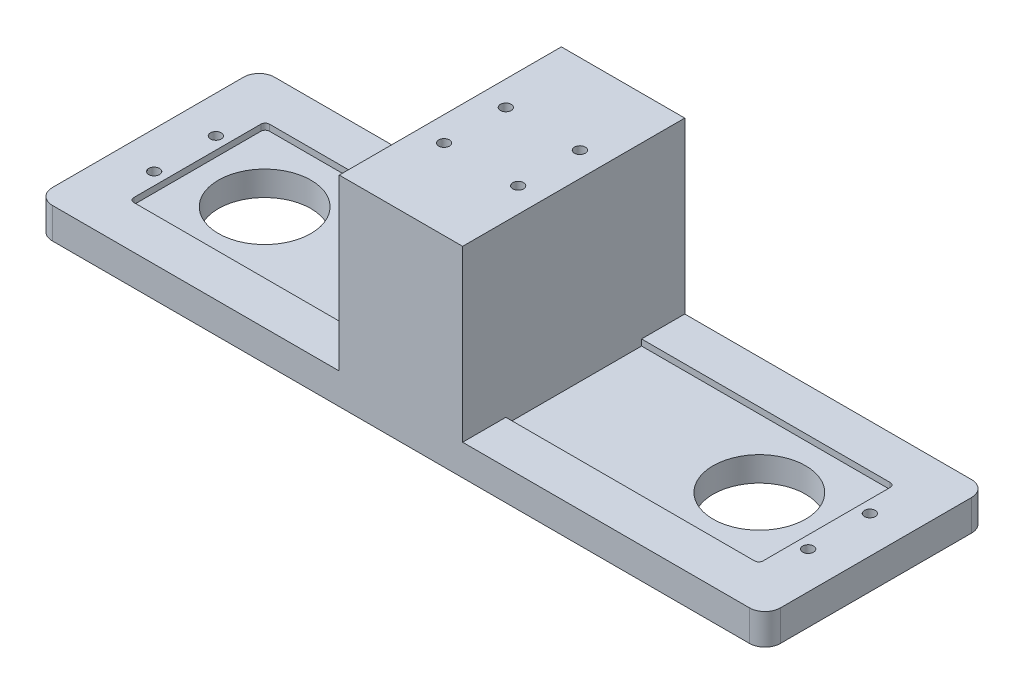
ISO-10303-21;
HEADER;
FILE_DESCRIPTION(('STEP AP214'),'2;1');
FILE_NAME('part.step','',(''),(''),'','','');
FILE_SCHEMA(('AUTOMOTIVE_DESIGN { 1 0 10303 214 1 1 1 1 }'));
ENDSEC;
DATA;
#1=APPLICATION_CONTEXT('core data for automotive mechanical design processes');
#2=APPLICATION_PROTOCOL_DEFINITION('international standard','automotive_design',2000,#1);
#3=PRODUCT_CONTEXT('',#1,'mechanical');
#4=PRODUCT('Part','Part','',(#3));
#5=PRODUCT_RELATED_PRODUCT_CATEGORY('part','',(#4));
#6=PRODUCT_DEFINITION_FORMATION('','',#4);
#7=PRODUCT_DEFINITION_CONTEXT('part definition',#1,'design');
#8=PRODUCT_DEFINITION('design','',#6,#7);
#9=PRODUCT_DEFINITION_SHAPE('','',#8);
#10=(LENGTH_UNIT() NAMED_UNIT(*) SI_UNIT(.MILLI.,.METRE.));
#11=(NAMED_UNIT(*) PLANE_ANGLE_UNIT() SI_UNIT($,.RADIAN.));
#12=(NAMED_UNIT(*) SI_UNIT($,.STERADIAN.) SOLID_ANGLE_UNIT());
#13=UNCERTAINTY_MEASURE_WITH_UNIT(LENGTH_MEASURE(1.E-05),#10,'distance_accuracy_value','');
#14=(GEOMETRIC_REPRESENTATION_CONTEXT(3) GLOBAL_UNCERTAINTY_ASSIGNED_CONTEXT((#13)) GLOBAL_UNIT_ASSIGNED_CONTEXT((#10,
#11,#12)) REPRESENTATION_CONTEXT('',''));
#15=CARTESIAN_POINT('',(0.,0.,0.));
#16=DIRECTION('',(0.,0.,1.));
#17=DIRECTION('',(1.,0.,0.));
#18=AXIS2_PLACEMENT_3D('',#15,#16,#17);
#19=CARTESIAN_POINT('',(0.,4.,0.));
#20=DIRECTION('',(0.,1.,0.));
#21=DIRECTION('',(0.,0.,1.));
#22=AXIS2_PLACEMENT_3D('',#19,#20,#21);
#23=PLANE('',#22);
#24=CARTESIAN_POINT('',(-40.09,4.,0.));
#25=DIRECTION('',(0.,1.,0.));
#26=DIRECTION('',(0.,0.,1.));
#27=AXIS2_PLACEMENT_3D('',#24,#25,#26);
#28=CIRCLE('',#27,7.5);
#29=CARTESIAN_POINT('',(-40.09,4.,7.50000000000001));
#30=VERTEX_POINT('',#29);
#31=EDGE_CURVE('E422',#30,#30,#28,.T.);
#32=ORIENTED_EDGE('',*,*,#31,.F.);
#33=EDGE_LOOP('',(#32));
#34=FACE_BOUND('',#33,.T.);
#35=DIRECTION('',(0.,0.,-1.));
#36=VECTOR('',#35,1.);
#37=CARTESIAN_POINT('',(-51.,4.,-11.));
#38=LINE('',#37,#36);
#39=CARTESIAN_POINT('',(-51.,4.,10.3));
#40=VERTEX_POINT('',#39);
#41=CARTESIAN_POINT('',(-51.,4.,-10.3));
#42=VERTEX_POINT('',#41);
#43=EDGE_CURVE('E211',#40,#42,#38,.T.);
#44=ORIENTED_EDGE('',*,*,#43,.F.);
#45=CARTESIAN_POINT('',(-50.3,4.,10.3));
#46=DIRECTION('',(0.,1.,0.));
#47=DIRECTION('',(0.,0.,1.));
#48=AXIS2_PLACEMENT_3D('',#45,#46,#47);
#49=CIRCLE('',#48,0.7);
#50=CARTESIAN_POINT('',(-50.3,4.,11.));
#51=VERTEX_POINT('',#50);
#52=EDGE_CURVE('E373',#40,#51,#49,.T.);
#53=ORIENTED_EDGE('',*,*,#52,.T.);
#54=DIRECTION('',(-1.,0.,0.));
#55=VECTOR('',#54,1.);
#56=CARTESIAN_POINT('',(-51.,4.,11.));
#57=LINE('',#56,#55);
#58=CARTESIAN_POINT('',(-10.,4.,11.));
#59=VERTEX_POINT('',#58);
#60=EDGE_CURVE('E262',#59,#51,#57,.T.);
#61=ORIENTED_EDGE('',*,*,#60,.F.);
#62=DIRECTION('',(0.,0.,1.));
#63=VECTOR('',#62,1.);
#64=CARTESIAN_POINT('',(-10.,4.,-18.));
#65=LINE('',#64,#63);
#66=CARTESIAN_POINT('',(-10.,4.,-11.));
#67=VERTEX_POINT('',#66);
#68=EDGE_CURVE('E295',#67,#59,#65,.T.);
#69=ORIENTED_EDGE('',*,*,#68,.F.);
#70=DIRECTION('',(1.,0.,0.));
#71=VECTOR('',#70,1.);
#72=CARTESIAN_POINT('',(-51.,4.,-11.));
#73=LINE('',#72,#71);
#74=CARTESIAN_POINT('',(-50.3,4.,-11.));
#75=VERTEX_POINT('',#74);
#76=EDGE_CURVE('E287',#75,#67,#73,.T.);
#77=ORIENTED_EDGE('',*,*,#76,.F.);
#78=CARTESIAN_POINT('',(-50.3,4.,-10.3));
#79=DIRECTION('',(0.,1.,0.));
#80=DIRECTION('',(0.,0.,1.));
#81=AXIS2_PLACEMENT_3D('',#78,#79,#80);
#82=CIRCLE('',#81,0.7);
#83=EDGE_CURVE('E362',#75,#42,#82,.T.);
#84=ORIENTED_EDGE('',*,*,#83,.T.);
#85=EDGE_LOOP('',(#44,#53,#61,#69,#77,#84));
#86=FACE_BOUND('',#85,.T.);
#87=ADVANCED_FACE('F40',(#34,#86),#23,.T.);
#88=CARTESIAN_POINT('',(-10.,32.5,-18.));
#89=DIRECTION('',(1.,0.,0.));
#90=DIRECTION('',(0.,0.,-1.));
#91=AXIS2_PLACEMENT_3D('',#88,#89,#90);
#92=PLANE('',#91);
#93=DIRECTION('',(0.,-1.,0.));
#94=VECTOR('',#93,1.);
#95=CARTESIAN_POINT('',(-10.,5.,-11.));
#96=LINE('',#95,#94);
#97=CARTESIAN_POINT('',(-10.,5.,-11.));
#98=VERTEX_POINT('',#97);
#99=EDGE_CURVE('E292',#98,#67,#96,.T.);
#100=ORIENTED_EDGE('',*,*,#99,.T.);
#101=ORIENTED_EDGE('',*,*,#68,.T.);
#102=DIRECTION('',(0.,-1.,0.));
#103=VECTOR('',#102,1.);
#104=CARTESIAN_POINT('',(-10.,5.,11.));
#105=LINE('',#104,#103);
#106=CARTESIAN_POINT('',(-10.,5.,11.));
#107=VERTEX_POINT('',#106);
#108=EDGE_CURVE('E285',#107,#59,#105,.T.);
#109=ORIENTED_EDGE('',*,*,#108,.F.);
#110=DIRECTION('',(0.,0.,-1.));
#111=VECTOR('',#110,1.);
#112=CARTESIAN_POINT('',(-10.,5.,11.));
#113=LINE('',#112,#111);
#114=CARTESIAN_POINT('',(-10.,5.00000000000001,18.));
#115=VERTEX_POINT('',#114);
#116=EDGE_CURVE('E280',#115,#107,#113,.T.);
#117=ORIENTED_EDGE('',*,*,#116,.F.);
#118=DIRECTION('',(0.,-1.,0.));
#119=VECTOR('',#118,1.);
#120=CARTESIAN_POINT('',(-10.,32.5,18.));
#121=LINE('',#120,#119);
#122=CARTESIAN_POINT('',(-10.,32.5,18.));
#123=VERTEX_POINT('',#122);
#124=EDGE_CURVE('E313',#123,#115,#121,.T.);
#125=ORIENTED_EDGE('',*,*,#124,.F.);
#126=DIRECTION('',(0.,0.,1.));
#127=VECTOR('',#126,1.);
#128=CARTESIAN_POINT('',(-10.,32.5,-18.));
#129=LINE('',#128,#127);
#130=CARTESIAN_POINT('',(-10.,32.5,-18.));
#131=VERTEX_POINT('',#130);
#132=EDGE_CURVE('E299',#131,#123,#129,.T.);
#133=ORIENTED_EDGE('',*,*,#132,.F.);
#134=DIRECTION('',(0.,-1.,0.));
#135=VECTOR('',#134,1.);
#136=CARTESIAN_POINT('',(-10.,32.5,-18.));
#137=LINE('',#136,#135);
#138=CARTESIAN_POINT('',(-10.,5.,-18.));
#139=VERTEX_POINT('',#138);
#140=EDGE_CURVE('E316',#131,#139,#137,.T.);
#141=ORIENTED_EDGE('',*,*,#140,.T.);
#142=DIRECTION('',(0.,0.,-1.));
#143=VECTOR('',#142,1.);
#144=CARTESIAN_POINT('',(-10.,5.,-18.));
#145=LINE('',#144,#143);
#146=EDGE_CURVE('E264',#98,#139,#145,.T.);
#147=ORIENTED_EDGE('',*,*,#146,.F.);
#148=EDGE_LOOP('',(#100,#101,#109,#117,#125,#133,#141,#147));
#149=FACE_BOUND('',#148,.T.);
#150=ADVANCED_FACE('F487',(#149),#92,.F.);
#151=CARTESIAN_POINT('',(40.09,4.,0.));
#152=DIRECTION('',(0.,1.,0.));
#153=DIRECTION('',(0.,0.,1.));
#154=AXIS2_PLACEMENT_3D('',#151,#152,#153);
#155=CIRCLE('',#154,7.5);
#156=CARTESIAN_POINT('',(40.09,4.,7.49999999999999));
#157=VERTEX_POINT('',#156);
#158=EDGE_CURVE('E430',#157,#157,#155,.F.);
#159=ORIENTED_EDGE('',*,*,#158,.T.);
#160=EDGE_LOOP('',(#159));
#161=FACE_BOUND('',#160,.T.);
#162=DIRECTION('',(0.,0.,-1.));
#163=VECTOR('',#162,1.);
#164=CARTESIAN_POINT('',(51.,4.,-11.));
#165=LINE('',#164,#163);
#166=CARTESIAN_POINT('',(51.,4.,10.3));
#167=VERTEX_POINT('',#166);
#168=CARTESIAN_POINT('',(51.,4.,-10.3));
#169=VERTEX_POINT('',#168);
#170=EDGE_CURVE('E251',#167,#169,#165,.T.);
#171=ORIENTED_EDGE('',*,*,#170,.T.);
#172=CARTESIAN_POINT('',(50.3,4.,-10.3));
#173=DIRECTION('',(0.,1.,0.));
#174=DIRECTION('',(0.,0.,1.));
#175=AXIS2_PLACEMENT_3D('',#172,#173,#174);
#176=CIRCLE('',#175,0.7);
#177=CARTESIAN_POINT('',(50.3,4.,-11.));
#178=VERTEX_POINT('',#177);
#179=EDGE_CURVE('E62',#169,#178,#176,.T.);
#180=ORIENTED_EDGE('',*,*,#179,.T.);
#181=DIRECTION('',(-1.,0.,0.));
#182=VECTOR('',#181,1.);
#183=CARTESIAN_POINT('',(51.,4.,-11.));
#184=LINE('',#183,#182);
#185=CARTESIAN_POINT('',(10.,4.,-11.));
#186=VERTEX_POINT('',#185);
#187=EDGE_CURVE('E255',#178,#186,#184,.T.);
#188=ORIENTED_EDGE('',*,*,#187,.T.);
#189=DIRECTION('',(0.,0.,-1.));
#190=VECTOR('',#189,1.);
#191=CARTESIAN_POINT('',(10.,4.,18.));
#192=LINE('',#191,#190);
#193=CARTESIAN_POINT('',(10.,4.,11.));
#194=VERTEX_POINT('',#193);
#195=EDGE_CURVE('E300',#194,#186,#192,.T.);
#196=ORIENTED_EDGE('',*,*,#195,.F.);
#197=DIRECTION('',(1.,0.,0.));
#198=VECTOR('',#197,1.);
#199=CARTESIAN_POINT('',(51.,4.,11.));
#200=LINE('',#199,#198);
#201=CARTESIAN_POINT('',(50.3,4.,11.));
#202=VERTEX_POINT('',#201);
#203=EDGE_CURVE('E206',#194,#202,#200,.T.);
#204=ORIENTED_EDGE('',*,*,#203,.T.);
#205=CARTESIAN_POINT('',(50.3,4.,10.3));
#206=DIRECTION('',(0.,1.,0.));
#207=DIRECTION('',(0.,0.,1.));
#208=AXIS2_PLACEMENT_3D('',#205,#206,#207);
#209=CIRCLE('',#208,0.7);
#210=EDGE_CURVE('E381',#202,#167,#209,.T.);
#211=ORIENTED_EDGE('',*,*,#210,.T.);
#212=EDGE_LOOP('',(#171,#180,#188,#196,#204,#211));
#213=FACE_BOUND('',#212,.T.);
#214=ADVANCED_FACE('F397',(#161,#213),#23,.T.);
#215=CARTESIAN_POINT('',(-56.5,4.,15.5));
#216=DIRECTION('',(0.,-1.,0.));
#217=DIRECTION('',(0.,0.,-1.));
#218=AXIS2_PLACEMENT_3D('',#215,#216,#217);
#219=CYLINDRICAL_SURFACE('',#218,2.5);
#220=CARTESIAN_POINT('',(-56.5,0.,15.5));
#221=DIRECTION('',(0.,1.,0.));
#222=DIRECTION('',(0.,0.,1.));
#223=AXIS2_PLACEMENT_3D('',#220,#221,#222);
#224=CIRCLE('',#223,2.5);
#225=CARTESIAN_POINT('',(-56.5,0.,18.));
#226=VERTEX_POINT('',#225);
#227=CARTESIAN_POINT('',(-59.,0.,15.5));
#228=VERTEX_POINT('',#227);
#229=EDGE_CURVE('E319',#226,#228,#224,.F.);
#230=ORIENTED_EDGE('',*,*,#229,.F.);
#231=DIRECTION('',(0.,-1.,0.));
#232=VECTOR('',#231,1.);
#233=CARTESIAN_POINT('',(-56.5,4.,18.));
#234=LINE('',#233,#232);
#235=CARTESIAN_POINT('',(-56.5,5.,18.));
#236=VERTEX_POINT('',#235);
#237=EDGE_CURVE('E357',#236,#226,#234,.T.);
#238=ORIENTED_EDGE('',*,*,#237,.F.);
#239=CARTESIAN_POINT('',(-56.5,5.,15.5));
#240=DIRECTION('',(0.,1.,0.));
#241=DIRECTION('',(0.,0.,1.));
#242=AXIS2_PLACEMENT_3D('',#239,#240,#241);
#243=CIRCLE('',#242,2.5);
#244=CARTESIAN_POINT('',(-59.,5.,15.5));
#245=VERTEX_POINT('',#244);
#246=EDGE_CURVE('E275',#245,#236,#243,.T.);
#247=ORIENTED_EDGE('',*,*,#246,.F.);
#248=DIRECTION('',(0.,-1.,0.));
#249=VECTOR('',#248,1.);
#250=CARTESIAN_POINT('',(-59.,4.,15.5));
#251=LINE('',#250,#249);
#252=EDGE_CURVE('E341',#245,#228,#251,.T.);
#253=ORIENTED_EDGE('',*,*,#252,.T.);
#254=EDGE_LOOP('',(#230,#238,#247,#253));
#255=FACE_BOUND('',#254,.T.);
#256=ADVANCED_FACE('F519',(#255),#219,.T.);
#257=CARTESIAN_POINT('',(0.,4.,18.));
#258=DIRECTION('',(0.,0.,1.));
#259=DIRECTION('',(1.,0.,0.));
#260=AXIS2_PLACEMENT_3D('',#257,#258,#259);
#261=PLANE('',#260);
#262=DIRECTION('',(1.,0.,0.));
#263=VECTOR('',#262,1.);
#264=CARTESIAN_POINT('',(-10.,5.,18.));
#265=LINE('',#264,#263);
#266=EDGE_CURVE('E278',#236,#115,#265,.T.);
#267=ORIENTED_EDGE('',*,*,#266,.F.);
#268=ORIENTED_EDGE('',*,*,#237,.T.);
#269=DIRECTION('',(-1.,0.,0.));
#270=VECTOR('',#269,1.);
#271=CARTESIAN_POINT('',(0.,0.,18.));
#272=LINE('',#271,#270);
#273=CARTESIAN_POINT('',(56.5,0.,18.));
#274=VERTEX_POINT('',#273);
#275=EDGE_CURVE('E322',#274,#226,#272,.T.);
#276=ORIENTED_EDGE('',*,*,#275,.F.);
#277=DIRECTION('',(0.,-1.,0.));
#278=VECTOR('',#277,1.);
#279=CARTESIAN_POINT('',(56.5,4.,18.));
#280=LINE('',#279,#278);
#281=CARTESIAN_POINT('',(56.5,5.,18.));
#282=VERTEX_POINT('',#281);
#283=EDGE_CURVE('E355',#282,#274,#280,.T.);
#284=ORIENTED_EDGE('',*,*,#283,.F.);
#285=DIRECTION('',(-1.,0.,0.));
#286=VECTOR('',#285,1.);
#287=CARTESIAN_POINT('',(10.,5.,18.));
#288=LINE('',#287,#286);
#289=CARTESIAN_POINT('',(10.,5.,18.));
#290=VERTEX_POINT('',#289);
#291=EDGE_CURVE('E229',#282,#290,#288,.T.);
#292=ORIENTED_EDGE('',*,*,#291,.T.);
#293=DIRECTION('',(0.,-1.,0.));
#294=VECTOR('',#293,1.);
#295=CARTESIAN_POINT('',(10.,32.5,18.));
#296=LINE('',#295,#294);
#297=CARTESIAN_POINT('',(10.,32.5,18.));
#298=VERTEX_POINT('',#297);
#299=EDGE_CURVE('E228',#298,#290,#296,.T.);
#300=ORIENTED_EDGE('',*,*,#299,.F.);
#301=DIRECTION('',(1.,0.,0.));
#302=VECTOR('',#301,1.);
#303=CARTESIAN_POINT('',(-10.,32.5,18.));
#304=LINE('',#303,#302);
#305=EDGE_CURVE('E302',#123,#298,#304,.T.);
#306=ORIENTED_EDGE('',*,*,#305,.F.);
#307=ORIENTED_EDGE('',*,*,#124,.T.);
#308=EDGE_LOOP('',(#267,#268,#276,#284,#292,#300,#306,#307));
#309=FACE_BOUND('',#308,.T.);
#310=ADVANCED_FACE('F493',(#309),#261,.T.);
#311=CARTESIAN_POINT('',(56.5,4.,15.5));
#312=DIRECTION('',(0.,-1.,0.));
#313=DIRECTION('',(0.,0.,-1.));
#314=AXIS2_PLACEMENT_3D('',#311,#312,#313);
#315=CYLINDRICAL_SURFACE('',#314,2.5);
#316=CARTESIAN_POINT('',(56.5,0.,15.5));
#317=DIRECTION('',(0.,1.,0.));
#318=DIRECTION('',(0.,0.,1.));
#319=AXIS2_PLACEMENT_3D('',#316,#317,#318);
#320=CIRCLE('',#319,2.5);
#321=CARTESIAN_POINT('',(59.,0.,15.5));
#322=VERTEX_POINT('',#321);
#323=EDGE_CURVE('E325',#322,#274,#320,.F.);
#324=ORIENTED_EDGE('',*,*,#323,.F.);
#325=DIRECTION('',(0.,-1.,0.));
#326=VECTOR('',#325,1.);
#327=CARTESIAN_POINT('',(59.,4.,15.5));
#328=LINE('',#327,#326);
#329=CARTESIAN_POINT('',(59.,5.,15.5));
#330=VERTEX_POINT('',#329);
#331=EDGE_CURVE('E353',#330,#322,#328,.T.);
#332=ORIENTED_EDGE('',*,*,#331,.F.);
#333=CARTESIAN_POINT('',(56.5,5.,15.5));
#334=DIRECTION('',(0.,-1.,0.));
#335=DIRECTION('',(0.,0.,1.));
#336=AXIS2_PLACEMENT_3D('',#333,#334,#335);
#337=CIRCLE('',#336,2.5);
#338=EDGE_CURVE('E231',#330,#282,#337,.T.);
#339=ORIENTED_EDGE('',*,*,#338,.T.);
#340=ORIENTED_EDGE('',*,*,#283,.T.);
#341=EDGE_LOOP('',(#324,#332,#339,#340));
#342=FACE_BOUND('',#341,.T.);
#343=ADVANCED_FACE('F523',(#342),#315,.T.);
#344=CARTESIAN_POINT('',(59.,4.,0.));
#345=DIRECTION('',(1.,0.,0.));
#346=DIRECTION('',(0.,0.,-1.));
#347=AXIS2_PLACEMENT_3D('',#344,#345,#346);
#348=PLANE('',#347);
#349=DIRECTION('',(0.,0.,1.));
#350=VECTOR('',#349,1.);
#351=CARTESIAN_POINT('',(59.,0.,0.));
#352=LINE('',#351,#350);
#353=CARTESIAN_POINT('',(59.,0.,-15.5));
#354=VERTEX_POINT('',#353);
#355=EDGE_CURVE('E328',#354,#322,#352,.T.);
#356=ORIENTED_EDGE('',*,*,#355,.F.);
#357=DIRECTION('',(0.,-1.,0.));
#358=VECTOR('',#357,1.);
#359=CARTESIAN_POINT('',(59.,4.,-15.5));
#360=LINE('',#359,#358);
#361=CARTESIAN_POINT('',(59.,5.,-15.5));
#362=VERTEX_POINT('',#361);
#363=EDGE_CURVE('E351',#362,#354,#360,.T.);
#364=ORIENTED_EDGE('',*,*,#363,.F.);
#365=DIRECTION('',(0.,0.,1.));
#366=VECTOR('',#365,1.);
#367=CARTESIAN_POINT('',(59.,5.,-15.5));
#368=LINE('',#367,#366);
#369=EDGE_CURVE('E237',#362,#330,#368,.T.);
#370=ORIENTED_EDGE('',*,*,#369,.T.);
#371=ORIENTED_EDGE('',*,*,#331,.T.);
#372=EDGE_LOOP('',(#356,#364,#370,#371));
#373=FACE_BOUND('',#372,.T.);
#374=ADVANCED_FACE('F525',(#373),#348,.T.);
#375=CARTESIAN_POINT('',(56.5,4.,-15.5));
#376=DIRECTION('',(0.,-1.,0.));
#377=DIRECTION('',(0.,0.,-1.));
#378=AXIS2_PLACEMENT_3D('',#375,#376,#377);
#379=CYLINDRICAL_SURFACE('',#378,2.5);
#380=CARTESIAN_POINT('',(56.5,0.,-15.5));
#381=DIRECTION('',(0.,1.,0.));
#382=DIRECTION('',(0.,0.,1.));
#383=AXIS2_PLACEMENT_3D('',#380,#381,#382);
#384=CIRCLE('',#383,2.5);
#385=CARTESIAN_POINT('',(56.5,0.,-18.));
#386=VERTEX_POINT('',#385);
#387=EDGE_CURVE('E331',#386,#354,#384,.F.);
#388=ORIENTED_EDGE('',*,*,#387,.F.);
#389=DIRECTION('',(0.,-1.,0.));
#390=VECTOR('',#389,1.);
#391=CARTESIAN_POINT('',(56.5,4.,-18.));
#392=LINE('',#391,#390);
#393=CARTESIAN_POINT('',(56.5,5.,-18.));
#394=VERTEX_POINT('',#393);
#395=EDGE_CURVE('E349',#394,#386,#392,.T.);
#396=ORIENTED_EDGE('',*,*,#395,.F.);
#397=CARTESIAN_POINT('',(56.5,5.,-15.5));
#398=DIRECTION('',(0.,-1.,0.));
#399=DIRECTION('',(0.,0.,1.));
#400=AXIS2_PLACEMENT_3D('',#397,#398,#399);
#401=CIRCLE('',#400,2.5);
#402=EDGE_CURVE('E240',#394,#362,#401,.T.);
#403=ORIENTED_EDGE('',*,*,#402,.T.);
#404=ORIENTED_EDGE('',*,*,#363,.T.);
#405=EDGE_LOOP('',(#388,#396,#403,#404));
#406=FACE_BOUND('',#405,.T.);
#407=ADVANCED_FACE('F502',(#406),#379,.T.);
#408=CARTESIAN_POINT('',(0.,4.,-18.));
#409=DIRECTION('',(0.,0.,1.));
#410=DIRECTION('',(1.,0.,0.));
#411=AXIS2_PLACEMENT_3D('',#408,#409,#410);
#412=PLANE('',#411);
#413=DIRECTION('',(0.,-1.,0.));
#414=VECTOR('',#413,1.);
#415=CARTESIAN_POINT('',(-56.5,4.,-18.));
#416=LINE('',#415,#414);
#417=CARTESIAN_POINT('',(-56.5,5.,-18.));
#418=VERTEX_POINT('',#417);
#419=CARTESIAN_POINT('',(-56.5,0.,-18.));
#420=VERTEX_POINT('',#419);
#421=EDGE_CURVE('E346',#418,#420,#416,.T.);
#422=ORIENTED_EDGE('',*,*,#421,.F.);
#423=DIRECTION('',(-1.,0.,0.));
#424=VECTOR('',#423,1.);
#425=CARTESIAN_POINT('',(-10.,5.,-18.));
#426=LINE('',#425,#424);
#427=EDGE_CURVE('E266',#139,#418,#426,.T.);
#428=ORIENTED_EDGE('',*,*,#427,.F.);
#429=ORIENTED_EDGE('',*,*,#140,.F.);
#430=DIRECTION('',(-1.,0.,0.));
#431=VECTOR('',#430,1.);
#432=CARTESIAN_POINT('',(9.99999999999999,32.5,-18.));
#433=LINE('',#432,#431);
#434=CARTESIAN_POINT('',(9.99999999999999,32.5,-18.));
#435=VERTEX_POINT('',#434);
#436=EDGE_CURVE('E296',#435,#131,#433,.T.);
#437=ORIENTED_EDGE('',*,*,#436,.F.);
#438=DIRECTION('',(0.,-1.,0.));
#439=VECTOR('',#438,1.);
#440=CARTESIAN_POINT('',(9.99999999999999,32.5,-18.));
#441=LINE('',#440,#439);
#442=CARTESIAN_POINT('',(9.99999999999999,5.00000000000001,-18.));
#443=VERTEX_POINT('',#442);
#444=EDGE_CURVE('E306',#435,#443,#441,.T.);
#445=ORIENTED_EDGE('',*,*,#444,.T.);
#446=DIRECTION('',(1.,0.,0.));
#447=VECTOR('',#446,1.);
#448=CARTESIAN_POINT('',(10.,5.,-18.));
#449=LINE('',#448,#447);
#450=EDGE_CURVE('E243',#443,#394,#449,.T.);
#451=ORIENTED_EDGE('',*,*,#450,.T.);
#452=ORIENTED_EDGE('',*,*,#395,.T.);
#453=DIRECTION('',(-1.,0.,0.));
#454=VECTOR('',#453,1.);
#455=CARTESIAN_POINT('',(0.,0.,-18.));
#456=LINE('',#455,#454);
#457=EDGE_CURVE('E334',#386,#420,#456,.T.);
#458=ORIENTED_EDGE('',*,*,#457,.T.);
#459=EDGE_LOOP('',(#422,#428,#429,#437,#445,#451,#452,#458));
#460=FACE_BOUND('',#459,.T.);
#461=ADVANCED_FACE('F484',(#460),#412,.F.);
#462=CARTESIAN_POINT('',(-56.5,4.,-15.5));
#463=DIRECTION('',(0.,-1.,0.));
#464=DIRECTION('',(0.,0.,-1.));
#465=AXIS2_PLACEMENT_3D('',#462,#463,#464);
#466=CYLINDRICAL_SURFACE('',#465,2.5);
#467=CARTESIAN_POINT('',(-56.5,0.,-15.5));
#468=DIRECTION('',(0.,1.,0.));
#469=DIRECTION('',(0.,0.,1.));
#470=AXIS2_PLACEMENT_3D('',#467,#468,#469);
#471=CIRCLE('',#470,2.5);
#472=CARTESIAN_POINT('',(-59.,0.,-15.5));
#473=VERTEX_POINT('',#472);
#474=EDGE_CURVE('E336',#420,#473,#471,.T.);
#475=ORIENTED_EDGE('',*,*,#474,.T.);
#476=DIRECTION('',(0.,-1.,0.));
#477=VECTOR('',#476,1.);
#478=CARTESIAN_POINT('',(-59.,4.,-15.5));
#479=LINE('',#478,#477);
#480=CARTESIAN_POINT('',(-59.,5.,-15.5));
#481=VERTEX_POINT('',#480);
#482=EDGE_CURVE('E343',#481,#473,#479,.T.);
#483=ORIENTED_EDGE('',*,*,#482,.F.);
#484=CARTESIAN_POINT('',(-56.5,5.,-15.5));
#485=DIRECTION('',(0.,1.,0.));
#486=DIRECTION('',(0.,0.,1.));
#487=AXIS2_PLACEMENT_3D('',#484,#485,#486);
#488=CIRCLE('',#487,2.5);
#489=EDGE_CURVE('E269',#418,#481,#488,.T.);
#490=ORIENTED_EDGE('',*,*,#489,.F.);
#491=ORIENTED_EDGE('',*,*,#421,.T.);
#492=EDGE_LOOP('',(#475,#483,#490,#491));
#493=FACE_BOUND('',#492,.T.);
#494=ADVANCED_FACE('F510',(#493),#466,.T.);
#495=CARTESIAN_POINT('',(-59.,4.,0.));
#496=DIRECTION('',(1.,0.,0.));
#497=DIRECTION('',(0.,0.,-1.));
#498=AXIS2_PLACEMENT_3D('',#495,#496,#497);
#499=PLANE('',#498);
#500=DIRECTION('',(0.,0.,1.));
#501=VECTOR('',#500,1.);
#502=CARTESIAN_POINT('',(-59.,0.,0.));
#503=LINE('',#502,#501);
#504=EDGE_CURVE('E338',#473,#228,#503,.T.);
#505=ORIENTED_EDGE('',*,*,#504,.T.);
#506=ORIENTED_EDGE('',*,*,#252,.F.);
#507=DIRECTION('',(0.,0.,1.));
#508=VECTOR('',#507,1.);
#509=CARTESIAN_POINT('',(-59.,5.,-15.5));
#510=LINE('',#509,#508);
#511=EDGE_CURVE('E272',#481,#245,#510,.T.);
#512=ORIENTED_EDGE('',*,*,#511,.F.);
#513=ORIENTED_EDGE('',*,*,#482,.T.);
#514=EDGE_LOOP('',(#505,#506,#512,#513));
#515=FACE_BOUND('',#514,.T.);
#516=ADVANCED_FACE('F516',(#515),#499,.F.);
#517=CARTESIAN_POINT('',(0.,0.,0.));
#518=DIRECTION('',(0.,1.,0.));
#519=DIRECTION('',(0.,0.,1.));
#520=AXIS2_PLACEMENT_3D('',#517,#518,#519);
#521=PLANE('',#520);
#522=CARTESIAN_POINT('',(40.09,0.,0.));
#523=DIRECTION('',(0.,1.,0.));
#524=DIRECTION('',(0.,0.,-1.));
#525=AXIS2_PLACEMENT_3D('',#522,#523,#524);
#526=CIRCLE('',#525,7.5);
#527=CARTESIAN_POINT('',(40.09,0.,-7.50000000000001));
#528=VERTEX_POINT('',#527);
#529=EDGE_CURVE('E433',#528,#528,#526,.T.);
#530=ORIENTED_EDGE('',*,*,#529,.T.);
#531=EDGE_LOOP('',(#530));
#532=FACE_BOUND('',#531,.T.);
#533=CARTESIAN_POINT('',(-40.09,0.,0.));
#534=DIRECTION('',(0.,-1.,0.));
#535=DIRECTION('',(0.,0.,-1.));
#536=AXIS2_PLACEMENT_3D('',#533,#534,#535);
#537=CIRCLE('',#536,7.5);
#538=CARTESIAN_POINT('',(-40.09,0.,-7.49999999999999));
#539=VERTEX_POINT('',#538);
#540=EDGE_CURVE('E427',#539,#539,#537,.T.);
#541=ORIENTED_EDGE('',*,*,#540,.F.);
#542=EDGE_LOOP('',(#541));
#543=FACE_BOUND('',#542,.T.);
#544=CARTESIAN_POINT('',(-53.,0.,-4.99999999999998));
#545=DIRECTION('',(0.,1.,0.));
#546=DIRECTION('',(0.,0.,1.));
#547=AXIS2_PLACEMENT_3D('',#544,#545,#546);
#548=CIRCLE('',#547,0.874999999999998);
#549=CARTESIAN_POINT('',(-53.,0.,-4.12499999999998));
#550=VERTEX_POINT('',#549);
#551=EDGE_CURVE('E414',#550,#550,#548,.T.);
#552=ORIENTED_EDGE('',*,*,#551,.T.);
#553=EDGE_LOOP('',(#552));
#554=FACE_BOUND('',#553,.T.);
#555=CARTESIAN_POINT('',(53.,0.,5.00000000000004));
#556=DIRECTION('',(0.,1.,0.));
#557=DIRECTION('',(0.,0.,-1.));
#558=AXIS2_PLACEMENT_3D('',#555,#556,#557);
#559=CIRCLE('',#558,0.875000000000001);
#560=CARTESIAN_POINT('',(53.,0.,4.12500000000004));
#561=VERTEX_POINT('',#560);
#562=EDGE_CURVE('E407',#561,#561,#559,.T.);
#563=ORIENTED_EDGE('',*,*,#562,.T.);
#564=EDGE_LOOP('',(#563));
#565=FACE_BOUND('',#564,.T.);
#566=CARTESIAN_POINT('',(53.,0.,-4.99999999999995));
#567=DIRECTION('',(0.,1.,0.));
#568=DIRECTION('',(0.,0.,-1.));
#569=AXIS2_PLACEMENT_3D('',#566,#567,#568);
#570=CIRCLE('',#569,0.874999999999998);
#571=CARTESIAN_POINT('',(53.,0.,-5.87499999999995));
#572=VERTEX_POINT('',#571);
#573=EDGE_CURVE('E419',#572,#572,#570,.T.);
#574=ORIENTED_EDGE('',*,*,#573,.T.);
#575=EDGE_LOOP('',(#574));
#576=FACE_BOUND('',#575,.T.);
#577=CARTESIAN_POINT('',(-53.,0.,5.00000000000002));
#578=DIRECTION('',(0.,1.,0.));
#579=DIRECTION('',(0.,0.,1.));
#580=AXIS2_PLACEMENT_3D('',#577,#578,#579);
#581=CIRCLE('',#580,0.874999999999998);
#582=CARTESIAN_POINT('',(-53.,0.,5.87500000000002));
#583=VERTEX_POINT('',#582);
#584=EDGE_CURVE('E253',#583,#583,#581,.T.);
#585=ORIENTED_EDGE('',*,*,#584,.T.);
#586=EDGE_LOOP('',(#585));
#587=FACE_BOUND('',#586,.T.);
#588=ORIENTED_EDGE('',*,*,#229,.T.);
#589=ORIENTED_EDGE('',*,*,#504,.F.);
#590=ORIENTED_EDGE('',*,*,#474,.F.);
#591=ORIENTED_EDGE('',*,*,#457,.F.);
#592=ORIENTED_EDGE('',*,*,#387,.T.);
#593=ORIENTED_EDGE('',*,*,#355,.T.);
#594=ORIENTED_EDGE('',*,*,#323,.T.);
#595=ORIENTED_EDGE('',*,*,#275,.T.);
#596=EDGE_LOOP('',(#588,#589,#590,#591,#592,#593,#594,#595));
#597=FACE_BOUND('',#596,.T.);
#598=ADVANCED_FACE('F505',(#532,#543,#554,#565,#576,#587,#597),#521,.F.);
#599=CARTESIAN_POINT('',(10.,32.5,18.));
#600=DIRECTION('',(-1.,0.,0.));
#601=DIRECTION('',(0.,0.,1.));
#602=AXIS2_PLACEMENT_3D('',#599,#600,#601);
#603=PLANE('',#602);
#604=DIRECTION('',(0.,0.,-1.));
#605=VECTOR('',#604,1.);
#606=CARTESIAN_POINT('',(10.,5.,11.));
#607=LINE('',#606,#605);
#608=CARTESIAN_POINT('',(10.,5.,11.));
#609=VERTEX_POINT('',#608);
#610=EDGE_CURVE('E218',#290,#609,#607,.T.);
#611=ORIENTED_EDGE('',*,*,#610,.T.);
#612=DIRECTION('',(0.,-1.,0.));
#613=VECTOR('',#612,1.);
#614=CARTESIAN_POINT('',(10.,5.,11.));
#615=LINE('',#614,#613);
#616=EDGE_CURVE('E199',#609,#194,#615,.T.);
#617=ORIENTED_EDGE('',*,*,#616,.T.);
#618=ORIENTED_EDGE('',*,*,#195,.T.);
#619=DIRECTION('',(0.,-1.,0.));
#620=VECTOR('',#619,1.);
#621=CARTESIAN_POINT('',(10.,5.,-11.));
#622=LINE('',#621,#620);
#623=CARTESIAN_POINT('',(10.,5.,-11.));
#624=VERTEX_POINT('',#623);
#625=EDGE_CURVE('E212',#624,#186,#622,.T.);
#626=ORIENTED_EDGE('',*,*,#625,.F.);
#627=DIRECTION('',(0.,0.,-1.));
#628=VECTOR('',#627,1.);
#629=CARTESIAN_POINT('',(10.,5.,-18.));
#630=LINE('',#629,#628);
#631=EDGE_CURVE('E246',#624,#443,#630,.T.);
#632=ORIENTED_EDGE('',*,*,#631,.T.);
#633=ORIENTED_EDGE('',*,*,#444,.F.);
#634=DIRECTION('',(0.,0.,-1.));
#635=VECTOR('',#634,1.);
#636=CARTESIAN_POINT('',(10.,32.5,18.));
#637=LINE('',#636,#635);
#638=EDGE_CURVE('E304',#298,#435,#637,.T.);
#639=ORIENTED_EDGE('',*,*,#638,.F.);
#640=ORIENTED_EDGE('',*,*,#299,.T.);
#641=EDGE_LOOP('',(#611,#617,#618,#626,#632,#633,#639,#640));
#642=FACE_BOUND('',#641,.T.);
#643=ADVANCED_FACE('F225',(#642),#603,.F.);
#644=CARTESIAN_POINT('',(0.,32.5,0.));
#645=DIRECTION('',(0.,1.,0.));
#646=DIRECTION('',(0.,0.,1.));
#647=AXIS2_PLACEMENT_3D('',#644,#645,#646);
#648=PLANE('',#647);
#649=CARTESIAN_POINT('',(6.,32.5,-4.99999999999999));
#650=DIRECTION('',(0.,1.,0.));
#651=DIRECTION('',(0.,0.,1.));
#652=AXIS2_PLACEMENT_3D('',#649,#650,#651);
#653=CIRCLE('',#652,0.875);
#654=CARTESIAN_POINT('',(6.,32.5,-4.12499999999999));
#655=VERTEX_POINT('',#654);
#656=EDGE_CURVE('E443',#655,#655,#653,.T.);
#657=ORIENTED_EDGE('',*,*,#656,.F.);
#658=EDGE_LOOP('',(#657));
#659=FACE_BOUND('',#658,.T.);
#660=CARTESIAN_POINT('',(6.,32.5,5.00000000000001));
#661=DIRECTION('',(0.,1.,0.));
#662=DIRECTION('',(0.,0.,1.));
#663=AXIS2_PLACEMENT_3D('',#660,#661,#662);
#664=CIRCLE('',#663,0.875);
#665=CARTESIAN_POINT('',(6.,32.5,5.87500000000001));
#666=VERTEX_POINT('',#665);
#667=EDGE_CURVE('E449',#666,#666,#664,.T.);
#668=ORIENTED_EDGE('',*,*,#667,.F.);
#669=EDGE_LOOP('',(#668));
#670=FACE_BOUND('',#669,.T.);
#671=CARTESIAN_POINT('',(-6.,32.5,5.00000000000001));
#672=DIRECTION('',(0.,1.,0.));
#673=DIRECTION('',(0.,0.,1.));
#674=AXIS2_PLACEMENT_3D('',#671,#672,#673);
#675=CIRCLE('',#674,0.875);
#676=CARTESIAN_POINT('',(-6.,32.5,5.87500000000001));
#677=VERTEX_POINT('',#676);
#678=EDGE_CURVE('E455',#677,#677,#675,.T.);
#679=ORIENTED_EDGE('',*,*,#678,.F.);
#680=EDGE_LOOP('',(#679));
#681=FACE_BOUND('',#680,.T.);
#682=CARTESIAN_POINT('',(-6.,32.5,-4.99999999999999));
#683=DIRECTION('',(0.,1.,0.));
#684=DIRECTION('',(0.,0.,1.));
#685=AXIS2_PLACEMENT_3D('',#682,#683,#684);
#686=CIRCLE('',#685,0.875);
#687=CARTESIAN_POINT('',(-6.,32.5,-4.12499999999999));
#688=VERTEX_POINT('',#687);
#689=EDGE_CURVE('E437',#688,#688,#686,.T.);
#690=ORIENTED_EDGE('',*,*,#689,.F.);
#691=EDGE_LOOP('',(#690));
#692=FACE_BOUND('',#691,.T.);
#693=ORIENTED_EDGE('',*,*,#436,.T.);
#694=ORIENTED_EDGE('',*,*,#132,.T.);
#695=ORIENTED_EDGE('',*,*,#305,.T.);
#696=ORIENTED_EDGE('',*,*,#638,.T.);
#697=EDGE_LOOP('',(#693,#694,#695,#696));
#698=FACE_BOUND('',#697,.T.);
#699=ADVANCED_FACE('F470',(#659,#670,#681,#692,#698),#648,.T.);
#700=CARTESIAN_POINT('',(-51.,5.,-11.));
#701=DIRECTION('',(-1.,0.,0.));
#702=DIRECTION('',(0.,0.,1.));
#703=AXIS2_PLACEMENT_3D('',#700,#701,#702);
#704=PLANE('',#703);
#705=DIRECTION('',(0.,0.,-1.));
#706=VECTOR('',#705,1.);
#707=CARTESIAN_POINT('',(-51.,5.,-11.));
#708=LINE('',#707,#706);
#709=CARTESIAN_POINT('',(-51.,5.,10.3));
#710=VERTEX_POINT('',#709);
#711=CARTESIAN_POINT('',(-51.,5.,-10.3));
#712=VERTEX_POINT('',#711);
#713=EDGE_CURVE('E259',#710,#712,#708,.T.);
#714=ORIENTED_EDGE('',*,*,#713,.F.);
#715=DIRECTION('',(0.,-1.,0.));
#716=VECTOR('',#715,1.);
#717=CARTESIAN_POINT('',(-51.,4.,10.3));
#718=LINE('',#717,#716);
#719=EDGE_CURVE('E370',#710,#40,#718,.T.);
#720=ORIENTED_EDGE('',*,*,#719,.T.);
#721=ORIENTED_EDGE('',*,*,#43,.T.);
#722=DIRECTION('',(0.,-1.,0.));
#723=VECTOR('',#722,1.);
#724=CARTESIAN_POINT('',(-51.,5.,-10.3));
#725=LINE('',#724,#723);
#726=EDGE_CURVE('E365',#42,#712,#725,.F.);
#727=ORIENTED_EDGE('',*,*,#726,.T.);
#728=EDGE_LOOP('',(#714,#720,#721,#727));
#729=FACE_BOUND('',#728,.T.);
#730=ADVANCED_FACE('F473',(#729),#704,.F.);
#731=CARTESIAN_POINT('',(-51.,5.,-11.));
#732=DIRECTION('',(0.,0.,-1.));
#733=DIRECTION('',(-1.,0.,0.));
#734=AXIS2_PLACEMENT_3D('',#731,#732,#733);
#735=PLANE('',#734);
#736=DIRECTION('',(1.,0.,0.));
#737=VECTOR('',#736,1.);
#738=CARTESIAN_POINT('',(-51.,5.,-11.));
#739=LINE('',#738,#737);
#740=CARTESIAN_POINT('',(-50.3,5.,-11.));
#741=VERTEX_POINT('',#740);
#742=EDGE_CURVE('E261',#741,#98,#739,.T.);
#743=ORIENTED_EDGE('',*,*,#742,.F.);
#744=DIRECTION('',(0.,-1.,0.));
#745=VECTOR('',#744,1.);
#746=CARTESIAN_POINT('',(-50.3,4.,-11.));
#747=LINE('',#746,#745);
#748=EDGE_CURVE('E359',#741,#75,#747,.T.);
#749=ORIENTED_EDGE('',*,*,#748,.T.);
#750=ORIENTED_EDGE('',*,*,#76,.T.);
#751=ORIENTED_EDGE('',*,*,#99,.F.);
#752=EDGE_LOOP('',(#743,#749,#750,#751));
#753=FACE_BOUND('',#752,.T.);
#754=ADVANCED_FACE('F592',(#753),#735,.F.);
#755=CARTESIAN_POINT('',(-51.,5.,11.));
#756=DIRECTION('',(0.,0.,1.));
#757=DIRECTION('',(1.,0.,0.));
#758=AXIS2_PLACEMENT_3D('',#755,#756,#757);
#759=PLANE('',#758);
#760=ORIENTED_EDGE('',*,*,#60,.T.);
#761=DIRECTION('',(0.,-1.,0.));
#762=VECTOR('',#761,1.);
#763=CARTESIAN_POINT('',(-50.3,5.,11.));
#764=LINE('',#763,#762);
#765=CARTESIAN_POINT('',(-50.3,5.,11.));
#766=VERTEX_POINT('',#765);
#767=EDGE_CURVE('E375',#51,#766,#764,.F.);
#768=ORIENTED_EDGE('',*,*,#767,.T.);
#769=DIRECTION('',(-1.,0.,0.));
#770=VECTOR('',#769,1.);
#771=CARTESIAN_POINT('',(-51.,5.,11.));
#772=LINE('',#771,#770);
#773=EDGE_CURVE('E282',#107,#766,#772,.T.);
#774=ORIENTED_EDGE('',*,*,#773,.F.);
#775=ORIENTED_EDGE('',*,*,#108,.T.);
#776=EDGE_LOOP('',(#760,#768,#774,#775));
#777=FACE_BOUND('',#776,.T.);
#778=ADVANCED_FACE('F582',(#777),#759,.F.);
#779=CARTESIAN_POINT('',(-56.5,5.,15.5));
#780=DIRECTION('',(0.,1.,0.));
#781=DIRECTION('',(0.,0.,1.));
#782=AXIS2_PLACEMENT_3D('',#779,#780,#781);
#783=PLANE('',#782);
#784=CARTESIAN_POINT('',(-53.,5.,-4.99999999999998));
#785=DIRECTION('',(0.,1.,0.));
#786=DIRECTION('',(0.,0.,1.));
#787=AXIS2_PLACEMENT_3D('',#784,#785,#786);
#788=CIRCLE('',#787,0.874999999999998);
#789=CARTESIAN_POINT('',(-53.,5.,-4.12499999999998));
#790=VERTEX_POINT('',#789);
#791=EDGE_CURVE('E404',#790,#790,#788,.T.);
#792=ORIENTED_EDGE('',*,*,#791,.F.);
#793=EDGE_LOOP('',(#792));
#794=FACE_BOUND('',#793,.T.);
#795=CARTESIAN_POINT('',(-53.,5.,5.00000000000002));
#796=DIRECTION('',(0.,1.,0.));
#797=DIRECTION('',(0.,0.,1.));
#798=AXIS2_PLACEMENT_3D('',#795,#796,#797);
#799=CIRCLE('',#798,0.874999999999998);
#800=CARTESIAN_POINT('',(-53.,5.,5.87500000000002));
#801=VERTEX_POINT('',#800);
#802=EDGE_CURVE('E401',#801,#801,#799,.T.);
#803=ORIENTED_EDGE('',*,*,#802,.F.);
#804=EDGE_LOOP('',(#803));
#805=FACE_BOUND('',#804,.T.);
#806=ORIENTED_EDGE('',*,*,#773,.T.);
#807=CARTESIAN_POINT('',(-50.3,5.,10.3));
#808=DIRECTION('',(0.,1.,0.));
#809=DIRECTION('',(0.,0.,1.));
#810=AXIS2_PLACEMENT_3D('',#807,#808,#809);
#811=CIRCLE('',#810,0.7);
#812=EDGE_CURVE('E377',#766,#710,#811,.F.);
#813=ORIENTED_EDGE('',*,*,#812,.T.);
#814=ORIENTED_EDGE('',*,*,#713,.T.);
#815=CARTESIAN_POINT('',(-50.3,5.,-10.3));
#816=DIRECTION('',(0.,1.,0.));
#817=DIRECTION('',(0.,0.,1.));
#818=AXIS2_PLACEMENT_3D('',#815,#816,#817);
#819=CIRCLE('',#818,0.7);
#820=EDGE_CURVE('E368',#712,#741,#819,.F.);
#821=ORIENTED_EDGE('',*,*,#820,.T.);
#822=ORIENTED_EDGE('',*,*,#742,.T.);
#823=ORIENTED_EDGE('',*,*,#146,.T.);
#824=ORIENTED_EDGE('',*,*,#427,.T.);
#825=ORIENTED_EDGE('',*,*,#489,.T.);
#826=ORIENTED_EDGE('',*,*,#511,.T.);
#827=ORIENTED_EDGE('',*,*,#246,.T.);
#828=ORIENTED_EDGE('',*,*,#266,.T.);
#829=ORIENTED_EDGE('',*,*,#116,.T.);
#830=EDGE_LOOP('',(#806,#813,#814,#821,#822,#823,#824,#825,#826,#827,#828,#829));
#831=FACE_BOUND('',#830,.T.);
#832=ADVANCED_FACE('F513',(#794,#805,#831),#783,.T.);
#833=CARTESIAN_POINT('',(-50.3,5.,-10.3));
#834=DIRECTION('',(0.,1.,0.));
#835=DIRECTION('',(0.,0.,1.));
#836=AXIS2_PLACEMENT_3D('',#833,#834,#835);
#837=CYLINDRICAL_SURFACE('',#836,0.7);
#838=ORIENTED_EDGE('',*,*,#820,.F.);
#839=ORIENTED_EDGE('',*,*,#726,.F.);
#840=ORIENTED_EDGE('',*,*,#83,.F.);
#841=ORIENTED_EDGE('',*,*,#748,.F.);
#842=EDGE_LOOP('',(#838,#839,#840,#841));
#843=FACE_BOUND('',#842,.T.);
#844=ADVANCED_FACE('F581',(#843),#837,.F.);
#845=CARTESIAN_POINT('',(-50.3,5.,10.3));
#846=DIRECTION('',(0.,1.,0.));
#847=DIRECTION('',(0.,0.,1.));
#848=AXIS2_PLACEMENT_3D('',#845,#846,#847);
#849=CYLINDRICAL_SURFACE('',#848,0.7);
#850=ORIENTED_EDGE('',*,*,#812,.F.);
#851=ORIENTED_EDGE('',*,*,#767,.F.);
#852=ORIENTED_EDGE('',*,*,#52,.F.);
#853=ORIENTED_EDGE('',*,*,#719,.F.);
#854=EDGE_LOOP('',(#850,#851,#852,#853));
#855=FACE_BOUND('',#854,.T.);
#856=ADVANCED_FACE('F589',(#855),#849,.F.);
#857=CARTESIAN_POINT('',(51.,5.,-11.));
#858=DIRECTION('',(-1.,0.,0.));
#859=DIRECTION('',(0.,0.,1.));
#860=AXIS2_PLACEMENT_3D('',#857,#858,#859);
#861=PLANE('',#860);
#862=DIRECTION('',(0.,0.,-1.));
#863=VECTOR('',#862,1.);
#864=CARTESIAN_POINT('',(51.,5.,-11.));
#865=LINE('',#864,#863);
#866=CARTESIAN_POINT('',(51.,5.,10.3));
#867=VERTEX_POINT('',#866);
#868=CARTESIAN_POINT('',(51.,5.,-10.3));
#869=VERTEX_POINT('',#868);
#870=EDGE_CURVE('E222',#867,#869,#865,.T.);
#871=ORIENTED_EDGE('',*,*,#870,.T.);
#872=DIRECTION('',(0.,-1.,0.));
#873=VECTOR('',#872,1.);
#874=CARTESIAN_POINT('',(51.,4.,-10.3));
#875=LINE('',#874,#873);
#876=EDGE_CURVE('E386',#869,#169,#875,.T.);
#877=ORIENTED_EDGE('',*,*,#876,.T.);
#878=ORIENTED_EDGE('',*,*,#170,.F.);
#879=DIRECTION('',(0.,-1.,0.));
#880=VECTOR('',#879,1.);
#881=CARTESIAN_POINT('',(51.,5.,10.3));
#882=LINE('',#881,#880);
#883=EDGE_CURVE('E383',#167,#867,#882,.F.);
#884=ORIENTED_EDGE('',*,*,#883,.T.);
#885=EDGE_LOOP('',(#871,#877,#878,#884));
#886=FACE_BOUND('',#885,.T.);
#887=ADVANCED_FACE('F393',(#886),#861,.T.);
#888=CARTESIAN_POINT('',(51.,5.,11.));
#889=DIRECTION('',(0.,0.,-1.));
#890=DIRECTION('',(-1.,0.,0.));
#891=AXIS2_PLACEMENT_3D('',#888,#889,#890);
#892=PLANE('',#891);
#893=DIRECTION('',(1.,0.,0.));
#894=VECTOR('',#893,1.);
#895=CARTESIAN_POINT('',(51.,5.,11.));
#896=LINE('',#895,#894);
#897=CARTESIAN_POINT('',(50.3,5.,11.));
#898=VERTEX_POINT('',#897);
#899=EDGE_CURVE('E203',#609,#898,#896,.T.);
#900=ORIENTED_EDGE('',*,*,#899,.T.);
#901=DIRECTION('',(0.,-1.,0.));
#902=VECTOR('',#901,1.);
#903=CARTESIAN_POINT('',(50.3,4.,11.));
#904=LINE('',#903,#902);
#905=EDGE_CURVE('E379',#898,#202,#904,.T.);
#906=ORIENTED_EDGE('',*,*,#905,.T.);
#907=ORIENTED_EDGE('',*,*,#203,.F.);
#908=ORIENTED_EDGE('',*,*,#616,.F.);
#909=EDGE_LOOP('',(#900,#906,#907,#908));
#910=FACE_BOUND('',#909,.T.);
#911=ADVANCED_FACE('F201',(#910),#892,.T.);
#912=CARTESIAN_POINT('',(51.,5.,-11.));
#913=DIRECTION('',(0.,0.,1.));
#914=DIRECTION('',(1.,0.,0.));
#915=AXIS2_PLACEMENT_3D('',#912,#913,#914);
#916=PLANE('',#915);
#917=ORIENTED_EDGE('',*,*,#187,.F.);
#918=DIRECTION('',(0.,-1.,0.));
#919=VECTOR('',#918,1.);
#920=CARTESIAN_POINT('',(50.3,5.,-11.));
#921=LINE('',#920,#919);
#922=CARTESIAN_POINT('',(50.3,5.,-11.));
#923=VERTEX_POINT('',#922);
#924=EDGE_CURVE('E48',#178,#923,#921,.F.);
#925=ORIENTED_EDGE('',*,*,#924,.T.);
#926=DIRECTION('',(-1.,0.,0.));
#927=VECTOR('',#926,1.);
#928=CARTESIAN_POINT('',(51.,5.,-11.));
#929=LINE('',#928,#927);
#930=EDGE_CURVE('E249',#923,#624,#929,.T.);
#931=ORIENTED_EDGE('',*,*,#930,.T.);
#932=ORIENTED_EDGE('',*,*,#625,.T.);
#933=EDGE_LOOP('',(#917,#925,#931,#932));
#934=FACE_BOUND('',#933,.T.);
#935=ADVANCED_FACE('F738',(#934),#916,.T.);
#936=CARTESIAN_POINT('',(56.5,5.,15.5));
#937=DIRECTION('',(0.,1.,0.));
#938=DIRECTION('',(0.,0.,1.));
#939=AXIS2_PLACEMENT_3D('',#936,#937,#938);
#940=PLANE('',#939);
#941=CARTESIAN_POINT('',(53.,5.,5.00000000000004));
#942=DIRECTION('',(0.,1.,0.));
#943=DIRECTION('',(0.,0.,-1.));
#944=AXIS2_PLACEMENT_3D('',#941,#942,#943);
#945=CIRCLE('',#944,0.875000000000001);
#946=CARTESIAN_POINT('',(53.,5.,4.12500000000004));
#947=VERTEX_POINT('',#946);
#948=EDGE_CURVE('E410',#947,#947,#945,.T.);
#949=ORIENTED_EDGE('',*,*,#948,.F.);
#950=EDGE_LOOP('',(#949));
#951=FACE_BOUND('',#950,.T.);
#952=CARTESIAN_POINT('',(53.,5.,-4.99999999999995));
#953=DIRECTION('',(0.,1.,0.));
#954=DIRECTION('',(0.,0.,-1.));
#955=AXIS2_PLACEMENT_3D('',#952,#953,#954);
#956=CIRCLE('',#955,0.874999999999998);
#957=CARTESIAN_POINT('',(53.,5.,-5.87499999999995));
#958=VERTEX_POINT('',#957);
#959=EDGE_CURVE('E411',#958,#958,#956,.T.);
#960=ORIENTED_EDGE('',*,*,#959,.F.);
#961=EDGE_LOOP('',(#960));
#962=FACE_BOUND('',#961,.T.);
#963=ORIENTED_EDGE('',*,*,#870,.F.);
#964=CARTESIAN_POINT('',(50.3,5.,10.3));
#965=DIRECTION('',(0.,1.,0.));
#966=DIRECTION('',(0.,0.,1.));
#967=AXIS2_PLACEMENT_3D('',#964,#965,#966);
#968=CIRCLE('',#967,0.7);
#969=EDGE_CURVE('E221',#867,#898,#968,.F.);
#970=ORIENTED_EDGE('',*,*,#969,.T.);
#971=ORIENTED_EDGE('',*,*,#899,.F.);
#972=ORIENTED_EDGE('',*,*,#610,.F.);
#973=ORIENTED_EDGE('',*,*,#291,.F.);
#974=ORIENTED_EDGE('',*,*,#338,.F.);
#975=ORIENTED_EDGE('',*,*,#369,.F.);
#976=ORIENTED_EDGE('',*,*,#402,.F.);
#977=ORIENTED_EDGE('',*,*,#450,.F.);
#978=ORIENTED_EDGE('',*,*,#631,.F.);
#979=ORIENTED_EDGE('',*,*,#930,.F.);
#980=CARTESIAN_POINT('',(50.3,5.,-10.3));
#981=DIRECTION('',(0.,1.,0.));
#982=DIRECTION('',(0.,0.,1.));
#983=AXIS2_PLACEMENT_3D('',#980,#981,#982);
#984=CIRCLE('',#983,0.7);
#985=EDGE_CURVE('E11',#923,#869,#984,.F.);
#986=ORIENTED_EDGE('',*,*,#985,.T.);
#987=EDGE_LOOP('',(#963,#970,#971,#972,#973,#974,#975,#976,#977,#978,#979,#986));
#988=FACE_BOUND('',#987,.T.);
#989=ADVANCED_FACE('F216',(#951,#962,#988),#940,.T.);
#990=CARTESIAN_POINT('',(50.3,5.,10.3));
#991=DIRECTION('',(0.,1.,0.));
#992=DIRECTION('',(0.,0.,1.));
#993=AXIS2_PLACEMENT_3D('',#990,#991,#992);
#994=CYLINDRICAL_SURFACE('',#993,0.7);
#995=ORIENTED_EDGE('',*,*,#969,.F.);
#996=ORIENTED_EDGE('',*,*,#883,.F.);
#997=ORIENTED_EDGE('',*,*,#210,.F.);
#998=ORIENTED_EDGE('',*,*,#905,.F.);
#999=EDGE_LOOP('',(#995,#996,#997,#998));
#1000=FACE_BOUND('',#999,.T.);
#1001=ADVANCED_FACE('F399',(#1000),#994,.F.);
#1002=CARTESIAN_POINT('',(50.3,5.,-10.3));
#1003=DIRECTION('',(0.,1.,0.));
#1004=DIRECTION('',(0.,0.,1.));
#1005=AXIS2_PLACEMENT_3D('',#1002,#1003,#1004);
#1006=CYLINDRICAL_SURFACE('',#1005,0.7);
#1007=ORIENTED_EDGE('',*,*,#985,.F.);
#1008=ORIENTED_EDGE('',*,*,#924,.F.);
#1009=ORIENTED_EDGE('',*,*,#179,.F.);
#1010=ORIENTED_EDGE('',*,*,#876,.F.);
#1011=EDGE_LOOP('',(#1007,#1008,#1009,#1010));
#1012=FACE_BOUND('',#1011,.T.);
#1013=ADVANCED_FACE('F42',(#1012),#1006,.F.);
#1014=CARTESIAN_POINT('',(53.,0.,-4.99999999999995));
#1015=DIRECTION('',(0.,1.,0.));
#1016=DIRECTION('',(0.,0.,1.));
#1017=AXIS2_PLACEMENT_3D('',#1014,#1015,#1016);
#1018=CYLINDRICAL_SURFACE('',#1017,0.874999999999998);
#1019=ORIENTED_EDGE('',*,*,#573,.F.);
#1020=EDGE_LOOP('',(#1019));
#1021=FACE_BOUND('',#1020,.T.);
#1022=ORIENTED_EDGE('',*,*,#959,.T.);
#1023=EDGE_LOOP('',(#1022));
#1024=FACE_BOUND('',#1023,.T.);
#1025=ADVANCED_FACE('F769',(#1021,#1024),#1018,.F.);
#1026=CARTESIAN_POINT('',(53.,0.,5.00000000000004));
#1027=DIRECTION('',(0.,1.,0.));
#1028=DIRECTION('',(0.,0.,1.));
#1029=AXIS2_PLACEMENT_3D('',#1026,#1027,#1028);
#1030=CYLINDRICAL_SURFACE('',#1029,0.875000000000001);
#1031=ORIENTED_EDGE('',*,*,#562,.F.);
#1032=EDGE_LOOP('',(#1031));
#1033=FACE_BOUND('',#1032,.T.);
#1034=ORIENTED_EDGE('',*,*,#948,.T.);
#1035=EDGE_LOOP('',(#1034));
#1036=FACE_BOUND('',#1035,.T.);
#1037=ADVANCED_FACE('F576',(#1033,#1036),#1030,.F.);
#1038=CARTESIAN_POINT('',(-53.,0.,5.00000000000002));
#1039=DIRECTION('',(0.,1.,0.));
#1040=DIRECTION('',(0.,0.,1.));
#1041=AXIS2_PLACEMENT_3D('',#1038,#1039,#1040);
#1042=CYLINDRICAL_SURFACE('',#1041,0.874999999999998);
#1043=ORIENTED_EDGE('',*,*,#584,.F.);
#1044=EDGE_LOOP('',(#1043));
#1045=FACE_BOUND('',#1044,.T.);
#1046=ORIENTED_EDGE('',*,*,#802,.T.);
#1047=EDGE_LOOP('',(#1046));
#1048=FACE_BOUND('',#1047,.T.);
#1049=ADVANCED_FACE('F572',(#1045,#1048),#1042,.F.);
#1050=CARTESIAN_POINT('',(-53.,0.,-4.99999999999998));
#1051=DIRECTION('',(0.,1.,0.));
#1052=DIRECTION('',(0.,0.,1.));
#1053=AXIS2_PLACEMENT_3D('',#1050,#1051,#1052);
#1054=CYLINDRICAL_SURFACE('',#1053,0.874999999999998);
#1055=ORIENTED_EDGE('',*,*,#551,.F.);
#1056=EDGE_LOOP('',(#1055));
#1057=FACE_BOUND('',#1056,.T.);
#1058=ORIENTED_EDGE('',*,*,#791,.T.);
#1059=EDGE_LOOP('',(#1058));
#1060=FACE_BOUND('',#1059,.T.);
#1061=ADVANCED_FACE('F575',(#1057,#1060),#1054,.F.);
#1062=CARTESIAN_POINT('',(-40.09,10.,0.));
#1063=DIRECTION('',(0.,-1.,0.));
#1064=DIRECTION('',(0.,0.,-1.));
#1065=AXIS2_PLACEMENT_3D('',#1062,#1063,#1064);
#1066=CYLINDRICAL_SURFACE('',#1065,7.5);
#1067=ORIENTED_EDGE('',*,*,#31,.T.);
#1068=EDGE_LOOP('',(#1067));
#1069=FACE_BOUND('',#1068,.T.);
#1070=ORIENTED_EDGE('',*,*,#540,.T.);
#1071=EDGE_LOOP('',(#1070));
#1072=FACE_BOUND('',#1071,.T.);
#1073=ADVANCED_FACE('F556',(#1069,#1072),#1066,.F.);
#1074=CARTESIAN_POINT('',(40.09,10.,0.));
#1075=DIRECTION('',(0.,-1.,0.));
#1076=DIRECTION('',(0.,0.,-1.));
#1077=AXIS2_PLACEMENT_3D('',#1074,#1075,#1076);
#1078=CYLINDRICAL_SURFACE('',#1077,7.5);
#1079=ORIENTED_EDGE('',*,*,#158,.F.);
#1080=EDGE_LOOP('',(#1079));
#1081=FACE_BOUND('',#1080,.T.);
#1082=ORIENTED_EDGE('',*,*,#529,.F.);
#1083=EDGE_LOOP('',(#1082));
#1084=FACE_BOUND('',#1083,.T.);
#1085=ADVANCED_FACE('F552',(#1081,#1084),#1078,.F.);
#1086=CARTESIAN_POINT('',(-6.,22.5,-4.99999999999999));
#1087=DIRECTION('',(0.,1.,0.));
#1088=DIRECTION('',(0.,0.,1.));
#1089=AXIS2_PLACEMENT_3D('',#1086,#1087,#1088);
#1090=CYLINDRICAL_SURFACE('',#1089,0.875);
#1091=CARTESIAN_POINT('',(-6.,22.5,-4.99999999999999));
#1092=DIRECTION('',(0.,1.,0.));
#1093=DIRECTION('',(0.,0.,1.));
#1094=AXIS2_PLACEMENT_3D('',#1091,#1092,#1093);
#1095=CIRCLE('',#1094,0.875);
#1096=CARTESIAN_POINT('',(-6.,22.5,-4.12499999999999));
#1097=VERTEX_POINT('',#1096);
#1098=EDGE_CURVE('E436',#1097,#1097,#1095,.T.);
#1099=ORIENTED_EDGE('',*,*,#1098,.F.);
#1100=EDGE_LOOP('',(#1099));
#1101=FACE_BOUND('',#1100,.T.);
#1102=ORIENTED_EDGE('',*,*,#689,.T.);
#1103=EDGE_LOOP('',(#1102));
#1104=FACE_BOUND('',#1103,.T.);
#1105=ADVANCED_FACE('F555',(#1101,#1104),#1090,.F.);
#1106=CARTESIAN_POINT('',(0.,22.5,0.));
#1107=DIRECTION('',(0.,1.,0.));
#1108=DIRECTION('',(0.,0.,1.));
#1109=AXIS2_PLACEMENT_3D('',#1106,#1107,#1108);
#1110=PLANE('',#1109);
#1111=ORIENTED_EDGE('',*,*,#1098,.T.);
#1112=EDGE_LOOP('',(#1111));
#1113=FACE_BOUND('',#1112,.T.);
#1114=ADVANCED_FACE('F466',(#1113),#1110,.T.);
#1115=CARTESIAN_POINT('',(-6.,22.5,5.00000000000001));
#1116=DIRECTION('',(0.,1.,0.));
#1117=DIRECTION('',(0.,0.,1.));
#1118=AXIS2_PLACEMENT_3D('',#1115,#1116,#1117);
#1119=CYLINDRICAL_SURFACE('',#1118,0.875);
#1120=CARTESIAN_POINT('',(-6.,22.5,5.00000000000001));
#1121=DIRECTION('',(0.,1.,0.));
#1122=DIRECTION('',(0.,0.,1.));
#1123=AXIS2_PLACEMENT_3D('',#1120,#1121,#1122);
#1124=CIRCLE('',#1123,0.875);
#1125=CARTESIAN_POINT('',(-6.,22.5,5.87500000000001));
#1126=VERTEX_POINT('',#1125);
#1127=EDGE_CURVE('E440',#1126,#1126,#1124,.T.);
#1128=ORIENTED_EDGE('',*,*,#1127,.F.);
#1129=EDGE_LOOP('',(#1128));
#1130=FACE_BOUND('',#1129,.T.);
#1131=ORIENTED_EDGE('',*,*,#678,.T.);
#1132=EDGE_LOOP('',(#1131));
#1133=FACE_BOUND('',#1132,.T.);
#1134=ADVANCED_FACE('F463',(#1130,#1133),#1119,.F.);
#1135=CARTESIAN_POINT('',(0.,22.5,0.));
#1136=DIRECTION('',(0.,1.,0.));
#1137=DIRECTION('',(0.,0.,1.));
#1138=AXIS2_PLACEMENT_3D('',#1135,#1136,#1137);
#1139=PLANE('',#1138);
#1140=ORIENTED_EDGE('',*,*,#1127,.T.);
#1141=EDGE_LOOP('',(#1140));
#1142=FACE_BOUND('',#1141,.T.);
#1143=ADVANCED_FACE('F461',(#1142),#1139,.T.);
#1144=CARTESIAN_POINT('',(6.,22.5,5.00000000000001));
#1145=DIRECTION('',(0.,1.,0.));
#1146=DIRECTION('',(0.,0.,1.));
#1147=AXIS2_PLACEMENT_3D('',#1144,#1145,#1146);
#1148=CYLINDRICAL_SURFACE('',#1147,0.875);
#1149=CARTESIAN_POINT('',(6.,22.5,5.00000000000001));
#1150=DIRECTION('',(0.,1.,0.));
#1151=DIRECTION('',(0.,0.,1.));
#1152=AXIS2_PLACEMENT_3D('',#1149,#1150,#1151);
#1153=CIRCLE('',#1152,0.875);
#1154=CARTESIAN_POINT('',(6.,22.5,5.87500000000001));
#1155=VERTEX_POINT('',#1154);
#1156=EDGE_CURVE('E452',#1155,#1155,#1153,.T.);
#1157=ORIENTED_EDGE('',*,*,#1156,.F.);
#1158=EDGE_LOOP('',(#1157));
#1159=FACE_BOUND('',#1158,.T.);
#1160=ORIENTED_EDGE('',*,*,#667,.T.);
#1161=EDGE_LOOP('',(#1160));
#1162=FACE_BOUND('',#1161,.T.);
#1163=ADVANCED_FACE('F847',(#1159,#1162),#1148,.F.);
#1164=CARTESIAN_POINT('',(0.,22.5,0.));
#1165=DIRECTION('',(0.,1.,0.));
#1166=DIRECTION('',(0.,0.,1.));
#1167=AXIS2_PLACEMENT_3D('',#1164,#1165,#1166);
#1168=PLANE('',#1167);
#1169=ORIENTED_EDGE('',*,*,#1156,.T.);
#1170=EDGE_LOOP('',(#1169));
#1171=FACE_BOUND('',#1170,.T.);
#1172=ADVANCED_FACE('F856',(#1171),#1168,.T.);
#1173=CARTESIAN_POINT('',(6.,22.5,-4.99999999999999));
#1174=DIRECTION('',(0.,1.,0.));
#1175=DIRECTION('',(0.,0.,1.));
#1176=AXIS2_PLACEMENT_3D('',#1173,#1174,#1175);
#1177=CYLINDRICAL_SURFACE('',#1176,0.875);
#1178=CARTESIAN_POINT('',(6.,22.5,-4.99999999999999));
#1179=DIRECTION('',(0.,1.,0.));
#1180=DIRECTION('',(0.,0.,1.));
#1181=AXIS2_PLACEMENT_3D('',#1178,#1179,#1180);
#1182=CIRCLE('',#1181,0.875);
#1183=CARTESIAN_POINT('',(6.,22.5,-4.12499999999999));
#1184=VERTEX_POINT('',#1183);
#1185=EDGE_CURVE('E446',#1184,#1184,#1182,.T.);
#1186=ORIENTED_EDGE('',*,*,#1185,.F.);
#1187=EDGE_LOOP('',(#1186));
#1188=FACE_BOUND('',#1187,.T.);
#1189=ORIENTED_EDGE('',*,*,#656,.T.);
#1190=EDGE_LOOP('',(#1189));
#1191=FACE_BOUND('',#1190,.T.);
#1192=ADVANCED_FACE('F866',(#1188,#1191),#1177,.F.);
#1193=CARTESIAN_POINT('',(0.,22.5,0.));
#1194=DIRECTION('',(0.,1.,0.));
#1195=DIRECTION('',(0.,0.,1.));
#1196=AXIS2_PLACEMENT_3D('',#1193,#1194,#1195);
#1197=PLANE('',#1196);
#1198=ORIENTED_EDGE('',*,*,#1185,.T.);
#1199=EDGE_LOOP('',(#1198));
#1200=FACE_BOUND('',#1199,.T.);
#1201=ADVANCED_FACE('F876',(#1200),#1197,.T.);
#1202=CLOSED_SHELL('',(#87,#150,#214,#256,#310,#343,#374,#407,#461,#494,#516,#598,#643,#699,
#730,#754,#778,#832,#844,#856,#887,#911,#935,#989,#1001,#1013,#1025,#1037,#1049,#1061,#1073,
#1085,#1105,#1114,#1134,#1143,#1163,#1172,#1192,#1201));
#1203=MANIFOLD_SOLID_BREP('B2',#1202);
#1204=ADVANCED_BREP_SHAPE_REPRESENTATION('',(#18,#1203),#14);
#1205=SHAPE_DEFINITION_REPRESENTATION(#9,#1204);
ENDSEC;
END-ISO-10303-21;
